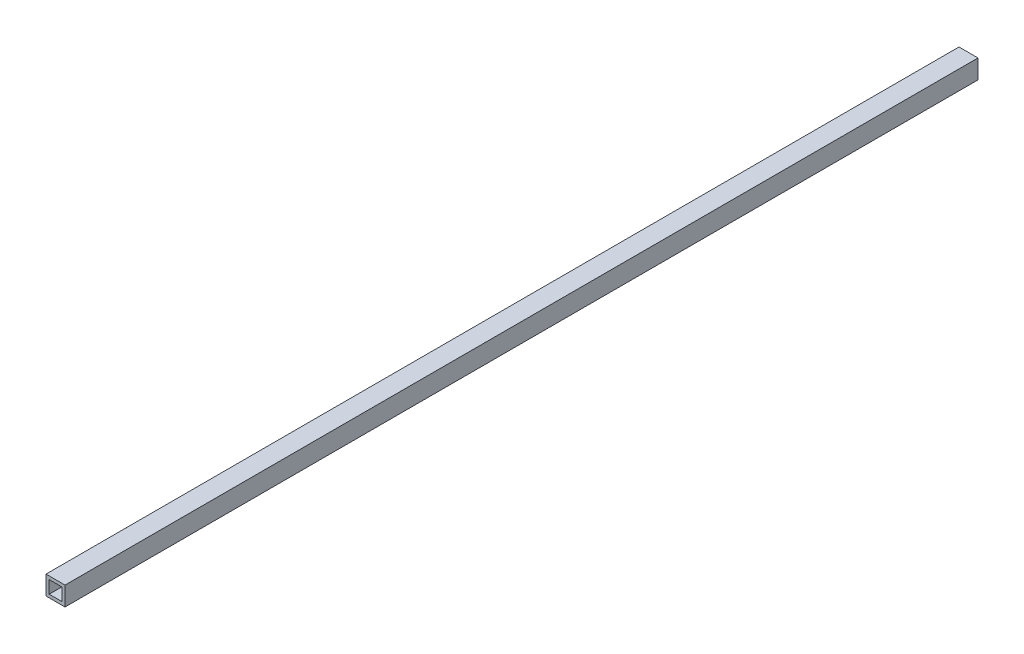
ISO-10303-21;
HEADER;
FILE_DESCRIPTION(('STEP AP214'),'2;1');
FILE_NAME('part.step','',(''),(''),'','','');
FILE_SCHEMA(('AUTOMOTIVE_DESIGN { 1 0 10303 214 1 1 1 1 }'));
ENDSEC;
DATA;
#1=APPLICATION_CONTEXT('core data for automotive mechanical design processes');
#2=APPLICATION_PROTOCOL_DEFINITION('international standard','automotive_design',2000,#1);
#3=PRODUCT_CONTEXT('',#1,'mechanical');
#4=PRODUCT('Part','Part','',(#3));
#5=PRODUCT_RELATED_PRODUCT_CATEGORY('part','',(#4));
#6=PRODUCT_DEFINITION_FORMATION('','',#4);
#7=PRODUCT_DEFINITION_CONTEXT('part definition',#1,'design');
#8=PRODUCT_DEFINITION('design','',#6,#7);
#9=PRODUCT_DEFINITION_SHAPE('','',#8);
#10=(LENGTH_UNIT() NAMED_UNIT(*) SI_UNIT(.MILLI.,.METRE.));
#11=(NAMED_UNIT(*) PLANE_ANGLE_UNIT() SI_UNIT($,.RADIAN.));
#12=(NAMED_UNIT(*) SI_UNIT($,.STERADIAN.) SOLID_ANGLE_UNIT());
#13=UNCERTAINTY_MEASURE_WITH_UNIT(LENGTH_MEASURE(1.E-05),#10,'distance_accuracy_value','');
#14=(GEOMETRIC_REPRESENTATION_CONTEXT(3) GLOBAL_UNCERTAINTY_ASSIGNED_CONTEXT((#13)) GLOBAL_UNIT_ASSIGNED_CONTEXT((#10,
#11,#12)) REPRESENTATION_CONTEXT('',''));
#15=CARTESIAN_POINT('',(0.,0.,0.));
#16=DIRECTION('',(0.,0.,1.));
#17=DIRECTION('',(1.,0.,0.));
#18=AXIS2_PLACEMENT_3D('',#15,#16,#17);
#19=CARTESIAN_POINT('',(0.,0.,914.4));
#20=DIRECTION('',(1.,0.,0.));
#21=DIRECTION('',(0.,0.,-1.));
#22=AXIS2_PLACEMENT_3D('',#19,#20,#21);
#23=PLANE('',#22);
#24=DIRECTION('',(0.,-1.,0.));
#25=VECTOR('',#24,1.);
#26=CARTESIAN_POINT('',(0.,0.,0.));
#27=LINE('',#26,#25);
#28=CARTESIAN_POINT('',(0.,19.05,0.));
#29=VERTEX_POINT('',#28);
#30=CARTESIAN_POINT('',(0.,0.,0.));
#31=VERTEX_POINT('',#30);
#32=EDGE_CURVE('E128',#29,#31,#27,.T.);
#33=ORIENTED_EDGE('',*,*,#32,.T.);
#34=DIRECTION('',(0.,0.,-1.));
#35=VECTOR('',#34,1.);
#36=CARTESIAN_POINT('',(0.,0.,914.4));
#37=LINE('',#36,#35);
#38=CARTESIAN_POINT('',(0.,0.,914.4));
#39=VERTEX_POINT('',#38);
#40=EDGE_CURVE('E11',#39,#31,#37,.T.);
#41=ORIENTED_EDGE('',*,*,#40,.F.);
#42=DIRECTION('',(0.,-1.,0.));
#43=VECTOR('',#42,1.);
#44=CARTESIAN_POINT('',(0.,0.,914.4));
#45=LINE('',#44,#43);
#46=CARTESIAN_POINT('',(0.,19.05,914.4));
#47=VERTEX_POINT('',#46);
#48=EDGE_CURVE('E132',#47,#39,#45,.T.);
#49=ORIENTED_EDGE('',*,*,#48,.F.);
#50=DIRECTION('',(0.,0.,-1.));
#51=VECTOR('',#50,1.);
#52=CARTESIAN_POINT('',(0.,19.05,914.4));
#53=LINE('',#52,#51);
#54=EDGE_CURVE('E142',#47,#29,#53,.T.);
#55=ORIENTED_EDGE('',*,*,#54,.T.);
#56=EDGE_LOOP('',(#33,#41,#49,#55));
#57=FACE_BOUND('',#56,.T.);
#58=ADVANCED_FACE('F31',(#57),#23,.F.);
#59=CARTESIAN_POINT('',(0.,0.,914.4));
#60=DIRECTION('',(0.,1.,0.));
#61=DIRECTION('',(0.,0.,1.));
#62=AXIS2_PLACEMENT_3D('',#59,#60,#61);
#63=PLANE('',#62);
#64=DIRECTION('',(1.,0.,0.));
#65=VECTOR('',#64,1.);
#66=CARTESIAN_POINT('',(0.,0.,0.));
#67=LINE('',#66,#65);
#68=CARTESIAN_POINT('',(19.05,0.,0.));
#69=VERTEX_POINT('',#68);
#70=EDGE_CURVE('E145',#31,#69,#67,.T.);
#71=ORIENTED_EDGE('',*,*,#70,.T.);
#72=DIRECTION('',(0.,0.,-1.));
#73=VECTOR('',#72,1.);
#74=CARTESIAN_POINT('',(19.05,0.,914.4));
#75=LINE('',#74,#73);
#76=CARTESIAN_POINT('',(19.05,0.,914.4));
#77=VERTEX_POINT('',#76);
#78=EDGE_CURVE('E38',#77,#69,#75,.T.);
#79=ORIENTED_EDGE('',*,*,#78,.F.);
#80=DIRECTION('',(1.,0.,0.));
#81=VECTOR('',#80,1.);
#82=CARTESIAN_POINT('',(0.,0.,914.4));
#83=LINE('',#82,#81);
#84=EDGE_CURVE('E135',#39,#77,#83,.T.);
#85=ORIENTED_EDGE('',*,*,#84,.F.);
#86=ORIENTED_EDGE('',*,*,#40,.T.);
#87=EDGE_LOOP('',(#71,#79,#85,#86));
#88=FACE_BOUND('',#87,.T.);
#89=ADVANCED_FACE('F173',(#88),#63,.F.);
#90=CARTESIAN_POINT('',(19.05,0.,914.4));
#91=DIRECTION('',(-1.,0.,0.));
#92=DIRECTION('',(0.,0.,1.));
#93=AXIS2_PLACEMENT_3D('',#90,#91,#92);
#94=PLANE('',#93);
#95=DIRECTION('',(0.,1.,0.));
#96=VECTOR('',#95,1.);
#97=CARTESIAN_POINT('',(19.05,0.,0.));
#98=LINE('',#97,#96);
#99=CARTESIAN_POINT('',(19.05,19.05,0.));
#100=VERTEX_POINT('',#99);
#101=EDGE_CURVE('E147',#69,#100,#98,.T.);
#102=ORIENTED_EDGE('',*,*,#101,.T.);
#103=DIRECTION('',(0.,0.,-1.));
#104=VECTOR('',#103,1.);
#105=CARTESIAN_POINT('',(19.05,19.05,914.4));
#106=LINE('',#105,#104);
#107=CARTESIAN_POINT('',(19.05,19.05,914.4));
#108=VERTEX_POINT('',#107);
#109=EDGE_CURVE('E152',#108,#100,#106,.T.);
#110=ORIENTED_EDGE('',*,*,#109,.F.);
#111=DIRECTION('',(0.,1.,0.));
#112=VECTOR('',#111,1.);
#113=CARTESIAN_POINT('',(19.05,0.,914.4));
#114=LINE('',#113,#112);
#115=EDGE_CURVE('E138',#77,#108,#114,.T.);
#116=ORIENTED_EDGE('',*,*,#115,.F.);
#117=ORIENTED_EDGE('',*,*,#78,.T.);
#118=EDGE_LOOP('',(#102,#110,#116,#117));
#119=FACE_BOUND('',#118,.T.);
#120=ADVANCED_FACE('F159',(#119),#94,.F.);
#121=CARTESIAN_POINT('',(0.,19.05,914.4));
#122=DIRECTION('',(0.,-1.,0.));
#123=DIRECTION('',(0.,0.,-1.));
#124=AXIS2_PLACEMENT_3D('',#121,#122,#123);
#125=PLANE('',#124);
#126=DIRECTION('',(-1.,0.,0.));
#127=VECTOR('',#126,1.);
#128=CARTESIAN_POINT('',(0.,19.05,0.));
#129=LINE('',#128,#127);
#130=EDGE_CURVE('E136',#100,#29,#129,.T.);
#131=ORIENTED_EDGE('',*,*,#130,.T.);
#132=ORIENTED_EDGE('',*,*,#54,.F.);
#133=DIRECTION('',(-1.,0.,0.));
#134=VECTOR('',#133,1.);
#135=CARTESIAN_POINT('',(0.,19.05,914.4));
#136=LINE('',#135,#134);
#137=EDGE_CURVE('E140',#108,#47,#136,.T.);
#138=ORIENTED_EDGE('',*,*,#137,.F.);
#139=ORIENTED_EDGE('',*,*,#109,.T.);
#140=EDGE_LOOP('',(#131,#132,#138,#139));
#141=FACE_BOUND('',#140,.T.);
#142=ADVANCED_FACE('F166',(#141),#125,.F.);
#143=CARTESIAN_POINT('',(0.,19.05,914.4));
#144=DIRECTION('',(0.,0.,-1.));
#145=DIRECTION('',(-1.,0.,0.));
#146=AXIS2_PLACEMENT_3D('',#143,#144,#145);
#147=PLANE('',#146);
#148=DIRECTION('',(1.,0.,0.));
#149=VECTOR('',#148,1.);
#150=CARTESIAN_POINT('',(3.175,3.175,914.4));
#151=LINE('',#150,#149);
#152=CARTESIAN_POINT('',(3.175,3.175,914.4));
#153=VERTEX_POINT('',#152);
#154=CARTESIAN_POINT('',(15.875,3.175,914.4));
#155=VERTEX_POINT('',#154);
#156=EDGE_CURVE('E122',#153,#155,#151,.T.);
#157=ORIENTED_EDGE('',*,*,#156,.F.);
#158=DIRECTION('',(0.,-1.,0.));
#159=VECTOR('',#158,1.);
#160=CARTESIAN_POINT('',(3.175,15.875,914.4));
#161=LINE('',#160,#159);
#162=CARTESIAN_POINT('',(3.175,15.875,914.4));
#163=VERTEX_POINT('',#162);
#164=EDGE_CURVE('E45',#163,#153,#161,.T.);
#165=ORIENTED_EDGE('',*,*,#164,.F.);
#166=DIRECTION('',(-1.,0.,0.));
#167=VECTOR('',#166,1.);
#168=CARTESIAN_POINT('',(3.175,15.875,914.4));
#169=LINE('',#168,#167);
#170=CARTESIAN_POINT('',(15.875,15.875,914.4));
#171=VERTEX_POINT('',#170);
#172=EDGE_CURVE('E113',#171,#163,#169,.T.);
#173=ORIENTED_EDGE('',*,*,#172,.F.);
#174=DIRECTION('',(0.,1.,0.));
#175=VECTOR('',#174,1.);
#176=CARTESIAN_POINT('',(15.875,15.875,914.4));
#177=LINE('',#176,#175);
#178=EDGE_CURVE('E116',#155,#171,#177,.T.);
#179=ORIENTED_EDGE('',*,*,#178,.F.);
#180=EDGE_LOOP('',(#157,#165,#173,#179));
#181=FACE_BOUND('',#180,.T.);
#182=ORIENTED_EDGE('',*,*,#48,.T.);
#183=ORIENTED_EDGE('',*,*,#84,.T.);
#184=ORIENTED_EDGE('',*,*,#115,.T.);
#185=ORIENTED_EDGE('',*,*,#137,.T.);
#186=EDGE_LOOP('',(#182,#183,#184,#185));
#187=FACE_BOUND('',#186,.T.);
#188=ADVANCED_FACE('F172',(#181,#187),#147,.F.);
#189=CARTESIAN_POINT('',(0.,19.05,0.));
#190=DIRECTION('',(0.,0.,-1.));
#191=DIRECTION('',(-1.,0.,0.));
#192=AXIS2_PLACEMENT_3D('',#189,#190,#191);
#193=PLANE('',#192);
#194=DIRECTION('',(0.,-1.,0.));
#195=VECTOR('',#194,1.);
#196=CARTESIAN_POINT('',(3.175,15.875,0.));
#197=LINE('',#196,#195);
#198=CARTESIAN_POINT('',(3.175,15.875,0.));
#199=VERTEX_POINT('',#198);
#200=CARTESIAN_POINT('',(3.175,3.175,0.));
#201=VERTEX_POINT('',#200);
#202=EDGE_CURVE('E97',#199,#201,#197,.T.);
#203=ORIENTED_EDGE('',*,*,#202,.T.);
#204=DIRECTION('',(1.,0.,0.));
#205=VECTOR('',#204,1.);
#206=CARTESIAN_POINT('',(3.175,3.175,0.));
#207=LINE('',#206,#205);
#208=CARTESIAN_POINT('',(15.875,3.175,0.));
#209=VERTEX_POINT('',#208);
#210=EDGE_CURVE('E106',#201,#209,#207,.T.);
#211=ORIENTED_EDGE('',*,*,#210,.T.);
#212=DIRECTION('',(0.,1.,0.));
#213=VECTOR('',#212,1.);
#214=CARTESIAN_POINT('',(15.875,15.875,0.));
#215=LINE('',#214,#213);
#216=CARTESIAN_POINT('',(15.875,15.875,0.));
#217=VERTEX_POINT('',#216);
#218=EDGE_CURVE('E53',#209,#217,#215,.T.);
#219=ORIENTED_EDGE('',*,*,#218,.T.);
#220=DIRECTION('',(-1.,0.,0.));
#221=VECTOR('',#220,1.);
#222=CARTESIAN_POINT('',(3.175,15.875,0.));
#223=LINE('',#222,#221);
#224=EDGE_CURVE('E103',#217,#199,#223,.T.);
#225=ORIENTED_EDGE('',*,*,#224,.T.);
#226=EDGE_LOOP('',(#203,#211,#219,#225));
#227=FACE_BOUND('',#226,.T.);
#228=ORIENTED_EDGE('',*,*,#32,.F.);
#229=ORIENTED_EDGE('',*,*,#130,.F.);
#230=ORIENTED_EDGE('',*,*,#101,.F.);
#231=ORIENTED_EDGE('',*,*,#70,.F.);
#232=EDGE_LOOP('',(#228,#229,#230,#231));
#233=FACE_BOUND('',#232,.T.);
#234=ADVANCED_FACE('F110',(#227,#233),#193,.T.);
#235=CARTESIAN_POINT('',(3.175,15.875,0.));
#236=DIRECTION('',(-1.,0.,0.));
#237=DIRECTION('',(0.,0.,1.));
#238=AXIS2_PLACEMENT_3D('',#235,#236,#237);
#239=PLANE('',#238);
#240=ORIENTED_EDGE('',*,*,#164,.T.);
#241=DIRECTION('',(0.,0.,1.));
#242=VECTOR('',#241,1.);
#243=CARTESIAN_POINT('',(3.175,3.175,0.));
#244=LINE('',#243,#242);
#245=EDGE_CURVE('E93',#201,#153,#244,.T.);
#246=ORIENTED_EDGE('',*,*,#245,.F.);
#247=ORIENTED_EDGE('',*,*,#202,.F.);
#248=DIRECTION('',(0.,0.,1.));
#249=VECTOR('',#248,1.);
#250=CARTESIAN_POINT('',(3.175,15.875,0.));
#251=LINE('',#250,#249);
#252=EDGE_CURVE('E126',#199,#163,#251,.T.);
#253=ORIENTED_EDGE('',*,*,#252,.T.);
#254=EDGE_LOOP('',(#240,#246,#247,#253));
#255=FACE_BOUND('',#254,.T.);
#256=ADVANCED_FACE('F95',(#255),#239,.F.);
#257=CARTESIAN_POINT('',(3.175,15.875,0.));
#258=DIRECTION('',(0.,1.,0.));
#259=DIRECTION('',(0.,0.,1.));
#260=AXIS2_PLACEMENT_3D('',#257,#258,#259);
#261=PLANE('',#260);
#262=ORIENTED_EDGE('',*,*,#172,.T.);
#263=ORIENTED_EDGE('',*,*,#252,.F.);
#264=ORIENTED_EDGE('',*,*,#224,.F.);
#265=DIRECTION('',(0.,0.,1.));
#266=VECTOR('',#265,1.);
#267=CARTESIAN_POINT('',(15.875,15.875,0.));
#268=LINE('',#267,#266);
#269=EDGE_CURVE('E129',#217,#171,#268,.T.);
#270=ORIENTED_EDGE('',*,*,#269,.T.);
#271=EDGE_LOOP('',(#262,#263,#264,#270));
#272=FACE_BOUND('',#271,.T.);
#273=ADVANCED_FACE('F190',(#272),#261,.F.);
#274=CARTESIAN_POINT('',(15.875,15.875,0.));
#275=DIRECTION('',(1.,0.,0.));
#276=DIRECTION('',(0.,0.,-1.));
#277=AXIS2_PLACEMENT_3D('',#274,#275,#276);
#278=PLANE('',#277);
#279=ORIENTED_EDGE('',*,*,#178,.T.);
#280=ORIENTED_EDGE('',*,*,#269,.F.);
#281=ORIENTED_EDGE('',*,*,#218,.F.);
#282=DIRECTION('',(0.,0.,1.));
#283=VECTOR('',#282,1.);
#284=CARTESIAN_POINT('',(15.875,3.175,0.));
#285=LINE('',#284,#283);
#286=EDGE_CURVE('E102',#209,#155,#285,.T.);
#287=ORIENTED_EDGE('',*,*,#286,.T.);
#288=EDGE_LOOP('',(#279,#280,#281,#287));
#289=FACE_BOUND('',#288,.T.);
#290=ADVANCED_FACE('F193',(#289),#278,.F.);
#291=CARTESIAN_POINT('',(3.175,3.175,0.));
#292=DIRECTION('',(0.,-1.,0.));
#293=DIRECTION('',(0.,0.,-1.));
#294=AXIS2_PLACEMENT_3D('',#291,#292,#293);
#295=PLANE('',#294);
#296=ORIENTED_EDGE('',*,*,#156,.T.);
#297=ORIENTED_EDGE('',*,*,#286,.F.);
#298=ORIENTED_EDGE('',*,*,#210,.F.);
#299=ORIENTED_EDGE('',*,*,#245,.T.);
#300=EDGE_LOOP('',(#296,#297,#298,#299));
#301=FACE_BOUND('',#300,.T.);
#302=ADVANCED_FACE('F107',(#301),#295,.F.);
#303=CLOSED_SHELL('',(#58,#89,#120,#142,#188,#234,#256,#273,#290,#302));
#304=MANIFOLD_SOLID_BREP('B2',#303);
#305=ADVANCED_BREP_SHAPE_REPRESENTATION('',(#18,#304),#14);
#306=SHAPE_DEFINITION_REPRESENTATION(#9,#305);
ENDSEC;
END-ISO-10303-21;
